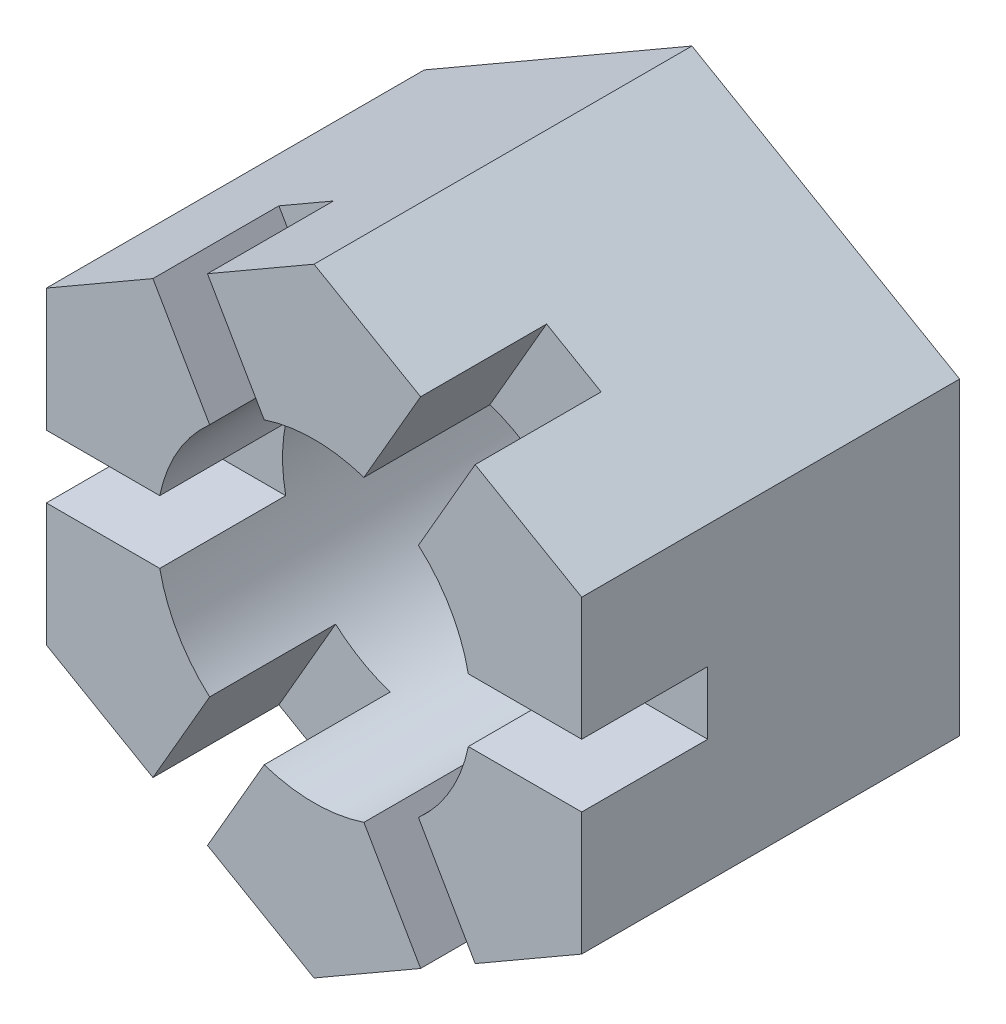
ISO-10303-21;
HEADER;
FILE_DESCRIPTION(('STEP AP214'),'2;1');
FILE_NAME('part.step','',(''),(''),'','','');
FILE_SCHEMA(('AUTOMOTIVE_DESIGN { 1 0 10303 214 1 1 1 1 }'));
ENDSEC;
DATA;
#1=APPLICATION_CONTEXT('core data for automotive mechanical design processes');
#2=APPLICATION_PROTOCOL_DEFINITION('international standard','automotive_design',2000,#1);
#3=PRODUCT_CONTEXT('',#1,'mechanical');
#4=PRODUCT('Part','Part','',(#3));
#5=PRODUCT_RELATED_PRODUCT_CATEGORY('part','',(#4));
#6=PRODUCT_DEFINITION_FORMATION('','',#4);
#7=PRODUCT_DEFINITION_CONTEXT('part definition',#1,'design');
#8=PRODUCT_DEFINITION('design','',#6,#7);
#9=PRODUCT_DEFINITION_SHAPE('','',#8);
#10=(LENGTH_UNIT() NAMED_UNIT(*) SI_UNIT(.MILLI.,.METRE.));
#11=(NAMED_UNIT(*) PLANE_ANGLE_UNIT() SI_UNIT($,.RADIAN.));
#12=(NAMED_UNIT(*) SI_UNIT($,.STERADIAN.) SOLID_ANGLE_UNIT());
#13=UNCERTAINTY_MEASURE_WITH_UNIT(LENGTH_MEASURE(1.E-05),#10,'distance_accuracy_value','');
#14=(GEOMETRIC_REPRESENTATION_CONTEXT(3) GLOBAL_UNCERTAINTY_ASSIGNED_CONTEXT((#13)) GLOBAL_UNIT_ASSIGNED_CONTEXT((#10,
#11,#12)) REPRESENTATION_CONTEXT('',''));
#15=CARTESIAN_POINT('',(0.,0.,0.));
#16=DIRECTION('',(0.,0.,1.));
#17=DIRECTION('',(1.,0.,0.));
#18=AXIS2_PLACEMENT_3D('',#15,#16,#17);
#19=CARTESIAN_POINT('',(0.,0.,12.));
#20=DIRECTION('',(0.,0.,-1.));
#21=DIRECTION('',(-1.,0.,0.));
#22=AXIS2_PLACEMENT_3D('',#19,#20,#21);
#23=PLANE('',#22);
#24=DIRECTION('',(-0.86602540378444,0.499999999999998,0.));
#25=VECTOR('',#24,1.);
#26=CARTESIAN_POINT('',(0.,9.81495457622361,12.));
#27=LINE('',#26,#25);
#28=CARTESIAN_POINT('',(8.5,4.90747728811182,12.));
#29=VERTEX_POINT('',#28);
#30=CARTESIAN_POINT('',(5.11602540378452,6.86121593216765,12.));
#31=VERTEX_POINT('',#30);
#32=EDGE_CURVE('E251',#29,#31,#27,.T.);
#33=ORIENTED_EDGE('',*,*,#32,.T.);
#34=DIRECTION('',(0.500000000000011,0.866025403784432,0.));
#35=VECTOR('',#34,1.);
#36=CARTESIAN_POINT('',(-5.50965760891762,-11.5430069109534,12.));
#37=LINE('',#36,#35);
#38=CARTESIAN_POINT('',(3.31551514656767,3.74264068711924,12.));
#39=VERTEX_POINT('',#38);
#40=EDGE_CURVE('E237',#39,#31,#37,.T.);
#41=ORIENTED_EDGE('',*,*,#40,.F.);
#42=CARTESIAN_POINT('',(0.,0.,12.));
#43=DIRECTION('',(0.,0.,1.));
#44=DIRECTION('',(1.,0.,0.));
#45=AXIS2_PLACEMENT_3D('',#42,#43,#44);
#46=CIRCLE('',#45,5.);
#47=CARTESIAN_POINT('',(4.89897948556636,0.999999999999992,12.));
#48=VERTEX_POINT('',#47);
#49=EDGE_CURVE('E249',#48,#39,#46,.T.);
#50=ORIENTED_EDGE('',*,*,#49,.F.);
#51=DIRECTION('',(1.,0.,0.));
#52=VECTOR('',#51,1.);
#53=CARTESIAN_POINT('',(-8.50100000000001,1.00000000000001,12.));
#54=LINE('',#53,#52);
#55=CARTESIAN_POINT('',(8.49999999999999,0.999999999999986,12.));
#56=VERTEX_POINT('',#55);
#57=EDGE_CURVE('E280',#48,#56,#54,.T.);
#58=ORIENTED_EDGE('',*,*,#57,.T.);
#59=DIRECTION('',(0.,1.,0.));
#60=VECTOR('',#59,1.);
#61=CARTESIAN_POINT('',(8.49999999999998,-4.90747728811181,12.));
#62=LINE('',#61,#60);
#63=EDGE_CURVE('E298',#56,#29,#62,.T.);
#64=ORIENTED_EDGE('',*,*,#63,.T.);
#65=EDGE_LOOP('',(#33,#41,#50,#58,#64));
#66=FACE_BOUND('',#65,.T.);
#67=ADVANCED_FACE('F36',(#66),#23,.F.);
#68=CARTESIAN_POINT('',(1.5834643389988,4.74264068711926,12.));
#69=VERTEX_POINT('',#68);
#70=CARTESIAN_POINT('',(-1.58346433899869,4.7426406871193,12.));
#71=VERTEX_POINT('',#70);
#72=EDGE_CURVE('E260',#69,#71,#46,.T.);
#73=ORIENTED_EDGE('',*,*,#72,.F.);
#74=DIRECTION('',(0.500000000000011,0.866025403784432,0.));
#75=VECTOR('',#74,1.);
#76=CARTESIAN_POINT('',(-7.24170841648649,-10.5430069109534,12.));
#77=LINE('',#76,#75);
#78=CARTESIAN_POINT('',(3.38397459621566,7.86121593216767,12.));
#79=VERTEX_POINT('',#78);
#80=EDGE_CURVE('E51',#69,#79,#77,.T.);
#81=ORIENTED_EDGE('',*,*,#80,.T.);
#82=CARTESIAN_POINT('',(0.,9.81495457622361,12.));
#83=VERTEX_POINT('',#82);
#84=EDGE_CURVE('E302',#79,#83,#27,.T.);
#85=ORIENTED_EDGE('',*,*,#84,.T.);
#86=DIRECTION('',(-0.86602540378444,-0.499999999999998,0.));
#87=VECTOR('',#86,1.);
#88=CARTESIAN_POINT('',(0.,9.81495457622361,12.));
#89=LINE('',#88,#87);
#90=CARTESIAN_POINT('',(-3.38397459621547,7.86121593216776,12.));
#91=VERTEX_POINT('',#90);
#92=EDGE_CURVE('E282',#83,#91,#89,.T.);
#93=ORIENTED_EDGE('',*,*,#92,.T.);
#94=DIRECTION('',(-0.499999999999991,0.866025403784444,0.));
#95=VECTOR('',#94,1.);
#96=CARTESIAN_POINT('',(7.24170841648621,-10.5430069109535,12.));
#97=LINE('',#96,#95);
#98=EDGE_CURVE('E437',#71,#91,#97,.T.);
#99=ORIENTED_EDGE('',*,*,#98,.F.);
#100=EDGE_LOOP('',(#73,#81,#85,#93,#99));
#101=FACE_BOUND('',#100,.T.);
#102=ADVANCED_FACE('F557',(#101),#23,.F.);
#103=CARTESIAN_POINT('',(-4.89897948556636,-0.999999999999992,12.));
#104=VERTEX_POINT('',#103);
#105=CARTESIAN_POINT('',(-3.31551514656764,-3.74264068711926,12.));
#106=VERTEX_POINT('',#105);
#107=EDGE_CURVE('E275',#104,#106,#46,.T.);
#108=ORIENTED_EDGE('',*,*,#107,.F.);
#109=DIRECTION('',(-1.,0.,0.));
#110=VECTOR('',#109,1.);
#111=CARTESIAN_POINT('',(8.50100000000001,-1.00000000000001,12.));
#112=LINE('',#111,#110);
#113=CARTESIAN_POINT('',(-8.49999999999999,-0.999999999999986,12.));
#114=VERTEX_POINT('',#113);
#115=EDGE_CURVE('E462',#104,#114,#112,.T.);
#116=ORIENTED_EDGE('',*,*,#115,.T.);
#117=DIRECTION('',(0.,-1.,0.));
#118=VECTOR('',#117,1.);
#119=CARTESIAN_POINT('',(-8.49999999999998,-4.90747728811181,12.));
#120=LINE('',#119,#118);
#121=CARTESIAN_POINT('',(-8.49999999999998,-4.90747728811181,12.));
#122=VERTEX_POINT('',#121);
#123=EDGE_CURVE('E285',#114,#122,#120,.T.);
#124=ORIENTED_EDGE('',*,*,#123,.T.);
#125=DIRECTION('',(0.866025403784438,-0.500000000000002,0.));
#126=VECTOR('',#125,1.);
#127=CARTESIAN_POINT('',(-8.49999999999998,-4.90747728811181,12.));
#128=LINE('',#127,#126);
#129=CARTESIAN_POINT('',(-5.11602540378448,-6.86121593216769,12.));
#130=VERTEX_POINT('',#129);
#131=EDGE_CURVE('E291',#122,#130,#128,.T.);
#132=ORIENTED_EDGE('',*,*,#131,.T.);
#133=DIRECTION('',(-0.500000000000005,-0.866025403784435,0.));
#134=VECTOR('',#133,1.);
#135=CARTESIAN_POINT('',(5.50965760891752,11.5430069109534,12.));
#136=LINE('',#135,#134);
#137=EDGE_CURVE('E487',#106,#130,#136,.T.);
#138=ORIENTED_EDGE('',*,*,#137,.F.);
#139=EDGE_LOOP('',(#108,#116,#124,#132,#138));
#140=FACE_BOUND('',#139,.T.);
#141=ADVANCED_FACE('F526',(#140),#23,.F.);
#142=CARTESIAN_POINT('',(-3.31551514656758,3.74264068711932,12.));
#143=VERTEX_POINT('',#142);
#144=CARTESIAN_POINT('',(-4.89897948556635,1.00000000000001,12.));
#145=VERTEX_POINT('',#144);
#146=EDGE_CURVE('E266',#143,#145,#46,.T.);
#147=ORIENTED_EDGE('',*,*,#146,.F.);
#148=DIRECTION('',(-0.499999999999991,0.866025403784444,0.));
#149=VECTOR('',#148,1.);
#150=CARTESIAN_POINT('',(5.50965760891732,-11.5430069109535,12.));
#151=LINE('',#150,#149);
#152=CARTESIAN_POINT('',(-5.11602540378436,6.86121593216777,12.));
#153=VERTEX_POINT('',#152);
#154=EDGE_CURVE('E59',#143,#153,#151,.T.);
#155=ORIENTED_EDGE('',*,*,#154,.T.);
#156=CARTESIAN_POINT('',(-8.5,4.90747728811182,12.));
#157=VERTEX_POINT('',#156);
#158=EDGE_CURVE('E286',#153,#157,#89,.T.);
#159=ORIENTED_EDGE('',*,*,#158,.T.);
#160=CARTESIAN_POINT('',(-8.49999999999999,1.00000000000001,12.));
#161=VERTEX_POINT('',#160);
#162=EDGE_CURVE('E287',#157,#161,#120,.T.);
#163=ORIENTED_EDGE('',*,*,#162,.T.);
#164=DIRECTION('',(-1.,0.,0.));
#165=VECTOR('',#164,1.);
#166=CARTESIAN_POINT('',(8.50100000000002,0.999999999999987,12.));
#167=LINE('',#166,#165);
#168=EDGE_CURVE('E461',#145,#161,#167,.T.);
#169=ORIENTED_EDGE('',*,*,#168,.F.);
#170=EDGE_LOOP('',(#147,#155,#159,#163,#169));
#171=FACE_BOUND('',#170,.T.);
#172=ADVANCED_FACE('F545',(#171),#23,.F.);
#173=CARTESIAN_POINT('',(-1.58346433899877,-4.74264068711928,12.));
#174=VERTEX_POINT('',#173);
#175=CARTESIAN_POINT('',(1.58346433899872,-4.74264068711929,12.));
#176=VERTEX_POINT('',#175);
#177=EDGE_CURVE('E269',#174,#176,#46,.T.);
#178=ORIENTED_EDGE('',*,*,#177,.F.);
#179=DIRECTION('',(-0.500000000000005,-0.866025403784435,0.));
#180=VECTOR('',#179,1.);
#181=CARTESIAN_POINT('',(7.24170841648639,10.5430069109534,12.));
#182=LINE('',#181,#180);
#183=CARTESIAN_POINT('',(-3.38397459621561,-7.8612159321677,12.));
#184=VERTEX_POINT('',#183);
#185=EDGE_CURVE('E488',#174,#184,#182,.T.);
#186=ORIENTED_EDGE('',*,*,#185,.T.);
#187=CARTESIAN_POINT('',(0.,-9.81495457622364,12.));
#188=VERTEX_POINT('',#187);
#189=EDGE_CURVE('E290',#184,#188,#128,.T.);
#190=ORIENTED_EDGE('',*,*,#189,.T.);
#191=DIRECTION('',(0.866025403784438,0.500000000000002,0.));
#192=VECTOR('',#191,1.);
#193=CARTESIAN_POINT('',(8.49999999999998,-4.90747728811181,12.));
#194=LINE('',#193,#192);
#195=CARTESIAN_POINT('',(3.38397459621552,-7.86121593216773,12.));
#196=VERTEX_POINT('',#195);
#197=EDGE_CURVE('E295',#188,#196,#194,.T.);
#198=ORIENTED_EDGE('',*,*,#197,.T.);
#199=DIRECTION('',(0.499999999999997,-0.866025403784441,0.));
#200=VECTOR('',#199,1.);
#201=CARTESIAN_POINT('',(-7.24170841648628,10.5430069109535,12.));
#202=LINE('',#201,#200);
#203=EDGE_CURVE('E367',#176,#196,#202,.T.);
#204=ORIENTED_EDGE('',*,*,#203,.F.);
#205=EDGE_LOOP('',(#178,#186,#190,#198,#204));
#206=FACE_BOUND('',#205,.T.);
#207=ADVANCED_FACE('F511',(#206),#23,.F.);
#208=CARTESIAN_POINT('',(3.3155151465676,-3.7426406871193,12.));
#209=VERTEX_POINT('',#208);
#210=CARTESIAN_POINT('',(4.89897948556635,-1.00000000000001,12.));
#211=VERTEX_POINT('',#210);
#212=EDGE_CURVE('E262',#209,#211,#46,.T.);
#213=ORIENTED_EDGE('',*,*,#212,.F.);
#214=DIRECTION('',(0.499999999999997,-0.866025403784441,0.));
#215=VECTOR('',#214,1.);
#216=CARTESIAN_POINT('',(-5.5096576089174,11.5430069109535,12.));
#217=LINE('',#216,#215);
#218=CARTESIAN_POINT('',(5.1160254037844,-6.86121593216774,12.));
#219=VERTEX_POINT('',#218);
#220=EDGE_CURVE('E360',#209,#219,#217,.T.);
#221=ORIENTED_EDGE('',*,*,#220,.T.);
#222=CARTESIAN_POINT('',(8.49999999999998,-4.90747728811181,12.));
#223=VERTEX_POINT('',#222);
#224=EDGE_CURVE('E294',#219,#223,#194,.T.);
#225=ORIENTED_EDGE('',*,*,#224,.T.);
#226=CARTESIAN_POINT('',(8.49999999999999,-1.00000000000001,12.));
#227=VERTEX_POINT('',#226);
#228=EDGE_CURVE('E299',#223,#227,#62,.T.);
#229=ORIENTED_EDGE('',*,*,#228,.T.);
#230=DIRECTION('',(1.,0.,0.));
#231=VECTOR('',#230,1.);
#232=CARTESIAN_POINT('',(-8.50100000000002,-0.999999999999987,12.));
#233=LINE('',#232,#231);
#234=EDGE_CURVE('E358',#211,#227,#233,.T.);
#235=ORIENTED_EDGE('',*,*,#234,.F.);
#236=EDGE_LOOP('',(#213,#221,#225,#229,#235));
#237=FACE_BOUND('',#236,.T.);
#238=ADVANCED_FACE('F357',(#237),#23,.F.);
#239=CARTESIAN_POINT('',(0.,0.,0.));
#240=DIRECTION('',(0.,0.,-1.));
#241=DIRECTION('',(-1.,0.,0.));
#242=AXIS2_PLACEMENT_3D('',#239,#240,#241);
#243=PLANE('',#242);
#244=DIRECTION('',(-0.86602540378444,-0.499999999999998,0.));
#245=VECTOR('',#244,1.);
#246=CARTESIAN_POINT('',(0.,9.81495457622361,0.));
#247=LINE('',#246,#245);
#248=CARTESIAN_POINT('',(0.,9.81495457622361,0.));
#249=VERTEX_POINT('',#248);
#250=CARTESIAN_POINT('',(-8.5,4.90747728811182,0.));
#251=VERTEX_POINT('',#250);
#252=EDGE_CURVE('E259',#249,#251,#247,.T.);
#253=ORIENTED_EDGE('',*,*,#252,.F.);
#254=DIRECTION('',(-0.86602540378444,0.499999999999998,0.));
#255=VECTOR('',#254,1.);
#256=CARTESIAN_POINT('',(0.,9.81495457622361,0.));
#257=LINE('',#256,#255);
#258=CARTESIAN_POINT('',(8.5,4.90747728811182,0.));
#259=VERTEX_POINT('',#258);
#260=EDGE_CURVE('E312',#259,#249,#257,.T.);
#261=ORIENTED_EDGE('',*,*,#260,.F.);
#262=DIRECTION('',(0.,1.,0.));
#263=VECTOR('',#262,1.);
#264=CARTESIAN_POINT('',(8.49999999999998,-4.90747728811181,0.));
#265=LINE('',#264,#263);
#266=CARTESIAN_POINT('',(8.49999999999998,-4.90747728811181,0.));
#267=VERTEX_POINT('',#266);
#268=EDGE_CURVE('E310',#267,#259,#265,.T.);
#269=ORIENTED_EDGE('',*,*,#268,.F.);
#270=DIRECTION('',(0.866025403784438,0.500000000000002,0.));
#271=VECTOR('',#270,1.);
#272=CARTESIAN_POINT('',(8.49999999999998,-4.90747728811181,0.));
#273=LINE('',#272,#271);
#274=CARTESIAN_POINT('',(0.,-9.81495457622364,0.));
#275=VERTEX_POINT('',#274);
#276=EDGE_CURVE('E308',#275,#267,#273,.T.);
#277=ORIENTED_EDGE('',*,*,#276,.F.);
#278=DIRECTION('',(0.866025403784438,-0.500000000000002,0.));
#279=VECTOR('',#278,1.);
#280=CARTESIAN_POINT('',(-8.49999999999998,-4.90747728811181,0.));
#281=LINE('',#280,#279);
#282=CARTESIAN_POINT('',(-8.49999999999998,-4.90747728811181,0.));
#283=VERTEX_POINT('',#282);
#284=EDGE_CURVE('E306',#283,#275,#281,.T.);
#285=ORIENTED_EDGE('',*,*,#284,.F.);
#286=DIRECTION('',(0.,-1.,0.));
#287=VECTOR('',#286,1.);
#288=CARTESIAN_POINT('',(-8.49999999999998,-4.90747728811181,0.));
#289=LINE('',#288,#287);
#290=EDGE_CURVE('E264',#251,#283,#289,.T.);
#291=ORIENTED_EDGE('',*,*,#290,.F.);
#292=EDGE_LOOP('',(#253,#261,#269,#277,#285,#291));
#293=FACE_BOUND('',#292,.T.);
#294=CARTESIAN_POINT('',(0.,0.,0.));
#295=DIRECTION('',(0.,0.,1.));
#296=DIRECTION('',(1.,0.,0.));
#297=AXIS2_PLACEMENT_3D('',#294,#295,#296);
#298=CIRCLE('',#297,5.);
#299=CARTESIAN_POINT('',(5.,0.,0.));
#300=VERTEX_POINT('',#299);
#301=EDGE_CURVE('E270',#300,#300,#298,.T.);
#302=ORIENTED_EDGE('',*,*,#301,.T.);
#303=EDGE_LOOP('',(#302));
#304=FACE_BOUND('',#303,.T.);
#305=ADVANCED_FACE('F338',(#293,#304),#243,.T.);
#306=CARTESIAN_POINT('',(0.,9.81495457622361,12.));
#307=DIRECTION('',(0.499999999999998,-0.86602540378444,0.));
#308=DIRECTION('',(0.86602540378444,0.499999999999998,0.));
#309=AXIS2_PLACEMENT_3D('',#306,#307,#308);
#310=PLANE('',#309);
#311=DIRECTION('',(-0.866025403784444,-0.49999999999999,0.));
#312=VECTOR('',#311,1.);
#313=CARTESIAN_POINT('',(-5.11602540378436,6.86121593216777,8.));
#314=LINE('',#313,#312);
#315=CARTESIAN_POINT('',(-3.38397459621547,7.86121593216776,8.));
#316=VERTEX_POINT('',#315);
#317=CARTESIAN_POINT('',(-5.11602540378436,6.86121593216777,8.));
#318=VERTEX_POINT('',#317);
#319=EDGE_CURVE('E432',#316,#318,#314,.T.);
#320=ORIENTED_EDGE('',*,*,#319,.F.);
#321=DIRECTION('',(0.,0.,-1.));
#322=VECTOR('',#321,1.);
#323=CARTESIAN_POINT('',(-3.38397459621547,7.86121593216776,8.));
#324=LINE('',#323,#322);
#325=EDGE_CURVE('E429',#91,#316,#324,.T.);
#326=ORIENTED_EDGE('',*,*,#325,.F.);
#327=ORIENTED_EDGE('',*,*,#92,.F.);
#328=DIRECTION('',(0.,0.,-1.));
#329=VECTOR('',#328,1.);
#330=CARTESIAN_POINT('',(0.,9.81495457622361,12.));
#331=LINE('',#330,#329);
#332=EDGE_CURVE('E303',#83,#249,#331,.T.);
#333=ORIENTED_EDGE('',*,*,#332,.T.);
#334=ORIENTED_EDGE('',*,*,#252,.T.);
#335=DIRECTION('',(0.,0.,-1.));
#336=VECTOR('',#335,1.);
#337=CARTESIAN_POINT('',(-8.5,4.90747728811182,12.));
#338=LINE('',#337,#336);
#339=EDGE_CURVE('E11',#157,#251,#338,.T.);
#340=ORIENTED_EDGE('',*,*,#339,.F.);
#341=ORIENTED_EDGE('',*,*,#158,.F.);
#342=DIRECTION('',(0.,0.,1.));
#343=VECTOR('',#342,1.);
#344=CARTESIAN_POINT('',(-5.11602540378436,6.86121593216777,8.));
#345=LINE('',#344,#343);
#346=EDGE_CURVE('E435',#318,#153,#345,.T.);
#347=ORIENTED_EDGE('',*,*,#346,.F.);
#348=EDGE_LOOP('',(#320,#326,#327,#333,#334,#340,#341,#347));
#349=FACE_BOUND('',#348,.T.);
#350=ADVANCED_FACE('F38',(#349),#310,.F.);
#351=CARTESIAN_POINT('',(-8.49999999999998,-4.90747728811181,12.));
#352=DIRECTION('',(1.,0.,0.));
#353=DIRECTION('',(0.,1.,0.));
#354=AXIS2_PLACEMENT_3D('',#351,#352,#353);
#355=PLANE('',#354);
#356=ORIENTED_EDGE('',*,*,#123,.F.);
#357=DIRECTION('',(0.,0.,1.));
#358=VECTOR('',#357,1.);
#359=CARTESIAN_POINT('',(-8.49999999999999,-0.999999999999986,8.));
#360=LINE('',#359,#358);
#361=CARTESIAN_POINT('',(-8.49999999999999,-0.999999999999986,8.));
#362=VERTEX_POINT('',#361);
#363=EDGE_CURVE('E459',#362,#114,#360,.T.);
#364=ORIENTED_EDGE('',*,*,#363,.F.);
#365=DIRECTION('',(0.,-1.,0.));
#366=VECTOR('',#365,1.);
#367=CARTESIAN_POINT('',(-8.49999999999999,-0.999999999999986,8.));
#368=LINE('',#367,#366);
#369=CARTESIAN_POINT('',(-8.49999999999999,1.00000000000001,8.));
#370=VERTEX_POINT('',#369);
#371=EDGE_CURVE('E456',#370,#362,#368,.T.);
#372=ORIENTED_EDGE('',*,*,#371,.F.);
#373=DIRECTION('',(0.,0.,-1.));
#374=VECTOR('',#373,1.);
#375=CARTESIAN_POINT('',(-8.49999999999999,1.00000000000001,8.));
#376=LINE('',#375,#374);
#377=EDGE_CURVE('E453',#161,#370,#376,.T.);
#378=ORIENTED_EDGE('',*,*,#377,.F.);
#379=ORIENTED_EDGE('',*,*,#162,.F.);
#380=ORIENTED_EDGE('',*,*,#339,.T.);
#381=ORIENTED_EDGE('',*,*,#290,.T.);
#382=DIRECTION('',(0.,0.,-1.));
#383=VECTOR('',#382,1.);
#384=CARTESIAN_POINT('',(-8.49999999999998,-4.90747728811181,12.));
#385=LINE('',#384,#383);
#386=EDGE_CURVE('E44',#122,#283,#385,.T.);
#387=ORIENTED_EDGE('',*,*,#386,.F.);
#388=EDGE_LOOP('',(#356,#364,#372,#378,#379,#380,#381,#387));
#389=FACE_BOUND('',#388,.T.);
#390=ADVANCED_FACE('F528',(#389),#355,.F.);
#391=CARTESIAN_POINT('',(-8.49999999999998,-4.90747728811181,12.));
#392=DIRECTION('',(0.500000000000002,0.866025403784438,0.));
#393=DIRECTION('',(-0.866025403784438,0.500000000000002,0.));
#394=AXIS2_PLACEMENT_3D('',#391,#392,#393);
#395=PLANE('',#394);
#396=DIRECTION('',(0.866025403784436,-0.500000000000006,0.));
#397=VECTOR('',#396,1.);
#398=CARTESIAN_POINT('',(-3.38397459621561,-7.8612159321677,8.));
#399=LINE('',#398,#397);
#400=CARTESIAN_POINT('',(-5.11602540378448,-6.86121593216769,8.));
#401=VERTEX_POINT('',#400);
#402=CARTESIAN_POINT('',(-3.38397459621561,-7.8612159321677,8.));
#403=VERTEX_POINT('',#402);
#404=EDGE_CURVE('E482',#401,#403,#399,.T.);
#405=ORIENTED_EDGE('',*,*,#404,.F.);
#406=DIRECTION('',(0.,0.,-1.));
#407=VECTOR('',#406,1.);
#408=CARTESIAN_POINT('',(-5.11602540378448,-6.86121593216769,8.));
#409=LINE('',#408,#407);
#410=EDGE_CURVE('E479',#130,#401,#409,.T.);
#411=ORIENTED_EDGE('',*,*,#410,.F.);
#412=ORIENTED_EDGE('',*,*,#131,.F.);
#413=ORIENTED_EDGE('',*,*,#386,.T.);
#414=ORIENTED_EDGE('',*,*,#284,.T.);
#415=DIRECTION('',(0.,0.,-1.));
#416=VECTOR('',#415,1.);
#417=CARTESIAN_POINT('',(0.,-9.81495457622364,12.));
#418=LINE('',#417,#416);
#419=EDGE_CURVE('E322',#188,#275,#418,.T.);
#420=ORIENTED_EDGE('',*,*,#419,.F.);
#421=ORIENTED_EDGE('',*,*,#189,.F.);
#422=DIRECTION('',(0.,0.,1.));
#423=VECTOR('',#422,1.);
#424=CARTESIAN_POINT('',(-3.38397459621561,-7.8612159321677,8.));
#425=LINE('',#424,#423);
#426=EDGE_CURVE('E485',#403,#184,#425,.T.);
#427=ORIENTED_EDGE('',*,*,#426,.F.);
#428=EDGE_LOOP('',(#405,#411,#412,#413,#414,#420,#421,#427));
#429=FACE_BOUND('',#428,.T.);
#430=ADVANCED_FACE('F330',(#429),#395,.F.);
#431=CARTESIAN_POINT('',(8.49999999999998,-4.90747728811181,12.));
#432=DIRECTION('',(-0.500000000000002,0.866025403784438,0.));
#433=DIRECTION('',(-0.866025403784438,-0.500000000000002,0.));
#434=AXIS2_PLACEMENT_3D('',#431,#432,#433);
#435=PLANE('',#434);
#436=DIRECTION('',(0.866025403784441,0.499999999999997,0.));
#437=VECTOR('',#436,1.);
#438=CARTESIAN_POINT('',(5.11602540378441,-6.86121593216774,8.));
#439=LINE('',#438,#437);
#440=CARTESIAN_POINT('',(3.38397459621552,-7.86121593216773,8.));
#441=VERTEX_POINT('',#440);
#442=CARTESIAN_POINT('',(5.11602540378441,-6.86121593216774,8.));
#443=VERTEX_POINT('',#442);
#444=EDGE_CURVE('E365',#441,#443,#439,.T.);
#445=ORIENTED_EDGE('',*,*,#444,.F.);
#446=DIRECTION('',(0.,0.,-1.));
#447=VECTOR('',#446,1.);
#448=CARTESIAN_POINT('',(3.38397459621552,-7.86121593216773,8.));
#449=LINE('',#448,#447);
#450=EDGE_CURVE('E371',#196,#441,#449,.T.);
#451=ORIENTED_EDGE('',*,*,#450,.F.);
#452=ORIENTED_EDGE('',*,*,#197,.F.);
#453=ORIENTED_EDGE('',*,*,#419,.T.);
#454=ORIENTED_EDGE('',*,*,#276,.T.);
#455=DIRECTION('',(0.,0.,-1.));
#456=VECTOR('',#455,1.);
#457=CARTESIAN_POINT('',(8.49999999999998,-4.90747728811181,12.));
#458=LINE('',#457,#456);
#459=EDGE_CURVE('E319',#223,#267,#458,.T.);
#460=ORIENTED_EDGE('',*,*,#459,.F.);
#461=ORIENTED_EDGE('',*,*,#224,.F.);
#462=DIRECTION('',(0.,0.,1.));
#463=VECTOR('',#462,1.);
#464=CARTESIAN_POINT('',(5.11602540378441,-6.86121593216774,8.));
#465=LINE('',#464,#463);
#466=EDGE_CURVE('E362',#443,#219,#465,.T.);
#467=ORIENTED_EDGE('',*,*,#466,.F.);
#468=EDGE_LOOP('',(#445,#451,#452,#453,#454,#460,#461,#467));
#469=FACE_BOUND('',#468,.T.);
#470=ADVANCED_FACE('F344',(#469),#435,.F.);
#471=CARTESIAN_POINT('',(8.49999999999998,-4.90747728811181,12.));
#472=DIRECTION('',(-1.,0.,0.));
#473=DIRECTION('',(0.,-1.,0.));
#474=AXIS2_PLACEMENT_3D('',#471,#472,#473);
#475=PLANE('',#474);
#476=DIRECTION('',(0.,1.,0.));
#477=VECTOR('',#476,1.);
#478=CARTESIAN_POINT('',(8.49999999999999,0.999999999999986,8.));
#479=LINE('',#478,#477);
#480=CARTESIAN_POINT('',(8.49999999999999,-1.00000000000001,8.));
#481=VERTEX_POINT('',#480);
#482=CARTESIAN_POINT('',(8.49999999999999,0.999999999999986,8.));
#483=VERTEX_POINT('',#482);
#484=EDGE_CURVE('E386',#481,#483,#479,.T.);
#485=ORIENTED_EDGE('',*,*,#484,.F.);
#486=DIRECTION('',(0.,0.,-1.));
#487=VECTOR('',#486,1.);
#488=CARTESIAN_POINT('',(8.49999999999999,-1.00000000000001,8.));
#489=LINE('',#488,#487);
#490=EDGE_CURVE('E354',#227,#481,#489,.T.);
#491=ORIENTED_EDGE('',*,*,#490,.F.);
#492=ORIENTED_EDGE('',*,*,#228,.F.);
#493=ORIENTED_EDGE('',*,*,#459,.T.);
#494=ORIENTED_EDGE('',*,*,#268,.T.);
#495=DIRECTION('',(0.,0.,-1.));
#496=VECTOR('',#495,1.);
#497=CARTESIAN_POINT('',(8.5,4.90747728811182,12.));
#498=LINE('',#497,#496);
#499=EDGE_CURVE('E316',#29,#259,#498,.T.);
#500=ORIENTED_EDGE('',*,*,#499,.F.);
#501=ORIENTED_EDGE('',*,*,#63,.F.);
#502=DIRECTION('',(0.,0.,1.));
#503=VECTOR('',#502,1.);
#504=CARTESIAN_POINT('',(8.49999999999999,0.999999999999986,8.));
#505=LINE('',#504,#503);
#506=EDGE_CURVE('E389',#483,#56,#505,.T.);
#507=ORIENTED_EDGE('',*,*,#506,.F.);
#508=EDGE_LOOP('',(#485,#491,#492,#493,#494,#500,#501,#507));
#509=FACE_BOUND('',#508,.T.);
#510=ADVANCED_FACE('F350',(#509),#475,.F.);
#511=CARTESIAN_POINT('',(0.,9.81495457622361,12.));
#512=DIRECTION('',(-0.499999999999998,-0.86602540378444,0.));
#513=DIRECTION('',(0.86602540378444,-0.499999999999998,0.));
#514=AXIS2_PLACEMENT_3D('',#511,#512,#513);
#515=PLANE('',#514);
#516=DIRECTION('',(-0.866025403784432,0.500000000000012,0.));
#517=VECTOR('',#516,1.);
#518=CARTESIAN_POINT('',(3.38397459621566,7.86121593216767,8.));
#519=LINE('',#518,#517);
#520=CARTESIAN_POINT('',(5.11602540378452,6.86121593216765,8.));
#521=VERTEX_POINT('',#520);
#522=CARTESIAN_POINT('',(3.38397459621566,7.86121593216767,8.));
#523=VERTEX_POINT('',#522);
#524=EDGE_CURVE('E412',#521,#523,#519,.T.);
#525=ORIENTED_EDGE('',*,*,#524,.F.);
#526=DIRECTION('',(0.,0.,-1.));
#527=VECTOR('',#526,1.);
#528=CARTESIAN_POINT('',(5.11602540378452,6.86121593216765,8.));
#529=LINE('',#528,#527);
#530=EDGE_CURVE('E409',#31,#521,#529,.T.);
#531=ORIENTED_EDGE('',*,*,#530,.F.);
#532=ORIENTED_EDGE('',*,*,#32,.F.);
#533=ORIENTED_EDGE('',*,*,#499,.T.);
#534=ORIENTED_EDGE('',*,*,#260,.T.);
#535=ORIENTED_EDGE('',*,*,#332,.F.);
#536=ORIENTED_EDGE('',*,*,#84,.F.);
#537=DIRECTION('',(0.,0.,1.));
#538=VECTOR('',#537,1.);
#539=CARTESIAN_POINT('',(3.38397459621566,7.86121593216767,8.));
#540=LINE('',#539,#538);
#541=EDGE_CURVE('E252',#523,#79,#540,.T.);
#542=ORIENTED_EDGE('',*,*,#541,.F.);
#543=EDGE_LOOP('',(#525,#531,#532,#533,#534,#535,#536,#542));
#544=FACE_BOUND('',#543,.T.);
#545=ADVANCED_FACE('F408',(#544),#515,.F.);
#546=CARTESIAN_POINT('',(0.,0.,12.));
#547=DIRECTION('',(0.,0.,-1.));
#548=DIRECTION('',(-1.,0.,0.));
#549=AXIS2_PLACEMENT_3D('',#546,#547,#548);
#550=CYLINDRICAL_SURFACE('',#549,5.);
#551=DIRECTION('',(0.,0.,-1.));
#552=VECTOR('',#551,1.);
#553=CARTESIAN_POINT('',(3.31551514656767,3.74264068711924,12.));
#554=LINE('',#553,#552);
#555=CARTESIAN_POINT('',(3.31551514656767,3.74264068711924,8.));
#556=VERTEX_POINT('',#555);
#557=EDGE_CURVE('E233',#39,#556,#554,.T.);
#558=ORIENTED_EDGE('',*,*,#557,.T.);
#559=CARTESIAN_POINT('',(0.,0.,8.));
#560=DIRECTION('',(0.,0.,-1.));
#561=DIRECTION('',(-1.,0.,0.));
#562=AXIS2_PLACEMENT_3D('',#559,#560,#561);
#563=CIRCLE('',#562,5.);
#564=CARTESIAN_POINT('',(1.5834643389988,4.74264068711926,8.));
#565=VERTEX_POINT('',#564);
#566=EDGE_CURVE('E416',#556,#565,#563,.F.);
#567=ORIENTED_EDGE('',*,*,#566,.T.);
#568=DIRECTION('',(0.,0.,-1.));
#569=VECTOR('',#568,1.);
#570=CARTESIAN_POINT('',(1.5834643389988,4.74264068711926,12.));
#571=LINE('',#570,#569);
#572=EDGE_CURVE('E413',#565,#69,#571,.F.);
#573=ORIENTED_EDGE('',*,*,#572,.T.);
#574=ORIENTED_EDGE('',*,*,#72,.T.);
#575=DIRECTION('',(0.,0.,-1.));
#576=VECTOR('',#575,1.);
#577=CARTESIAN_POINT('',(-1.58346433899869,4.7426406871193,12.));
#578=LINE('',#577,#576);
#579=CARTESIAN_POINT('',(-1.58346433899868,4.7426406871193,8.));
#580=VERTEX_POINT('',#579);
#581=EDGE_CURVE('E439',#71,#580,#578,.T.);
#582=ORIENTED_EDGE('',*,*,#581,.T.);
#583=CARTESIAN_POINT('',(0.,0.,8.));
#584=DIRECTION('',(0.,0.,-1.));
#585=DIRECTION('',(-1.,0.,0.));
#586=AXIS2_PLACEMENT_3D('',#583,#584,#585);
#587=CIRCLE('',#586,5.);
#588=CARTESIAN_POINT('',(-3.31551514656758,3.74264068711932,8.));
#589=VERTEX_POINT('',#588);
#590=EDGE_CURVE('E243',#580,#589,#587,.F.);
#591=ORIENTED_EDGE('',*,*,#590,.T.);
#592=DIRECTION('',(0.,0.,-1.));
#593=VECTOR('',#592,1.);
#594=CARTESIAN_POINT('',(-3.31551514656758,3.74264068711932,12.));
#595=LINE('',#594,#593);
#596=EDGE_CURVE('E427',#589,#143,#595,.F.);
#597=ORIENTED_EDGE('',*,*,#596,.T.);
#598=ORIENTED_EDGE('',*,*,#146,.T.);
#599=DIRECTION('',(0.,0.,-1.));
#600=VECTOR('',#599,1.);
#601=CARTESIAN_POINT('',(-4.89897948556635,1.00000000000001,12.));
#602=LINE('',#601,#600);
#603=CARTESIAN_POINT('',(-4.89897948556635,1.00000000000001,8.));
#604=VERTEX_POINT('',#603);
#605=EDGE_CURVE('E465',#145,#604,#602,.T.);
#606=ORIENTED_EDGE('',*,*,#605,.T.);
#607=CARTESIAN_POINT('',(0.,0.,8.));
#608=DIRECTION('',(0.,0.,-1.));
#609=DIRECTION('',(-1.,0.,0.));
#610=AXIS2_PLACEMENT_3D('',#607,#608,#609);
#611=CIRCLE('',#610,5.);
#612=CARTESIAN_POINT('',(-4.89897948556636,-0.999999999999992,8.));
#613=VERTEX_POINT('',#612);
#614=EDGE_CURVE('E447',#604,#613,#611,.F.);
#615=ORIENTED_EDGE('',*,*,#614,.T.);
#616=DIRECTION('',(0.,0.,-1.));
#617=VECTOR('',#616,1.);
#618=CARTESIAN_POINT('',(-4.89897948556636,-0.999999999999992,12.));
#619=LINE('',#618,#617);
#620=EDGE_CURVE('E450',#613,#104,#619,.F.);
#621=ORIENTED_EDGE('',*,*,#620,.T.);
#622=ORIENTED_EDGE('',*,*,#107,.T.);
#623=DIRECTION('',(0.,0.,-1.));
#624=VECTOR('',#623,1.);
#625=CARTESIAN_POINT('',(-3.31551514656764,-3.74264068711926,12.));
#626=LINE('',#625,#624);
#627=CARTESIAN_POINT('',(-3.31551514656764,-3.74264068711926,8.));
#628=VERTEX_POINT('',#627);
#629=EDGE_CURVE('E491',#106,#628,#626,.T.);
#630=ORIENTED_EDGE('',*,*,#629,.T.);
#631=CARTESIAN_POINT('',(0.,0.,8.));
#632=DIRECTION('',(0.,0.,-1.));
#633=DIRECTION('',(-1.,0.,0.));
#634=AXIS2_PLACEMENT_3D('',#631,#632,#633);
#635=CIRCLE('',#634,5.);
#636=CARTESIAN_POINT('',(-1.58346433899877,-4.74264068711928,8.));
#637=VERTEX_POINT('',#636);
#638=EDGE_CURVE('E473',#628,#637,#635,.F.);
#639=ORIENTED_EDGE('',*,*,#638,.T.);
#640=DIRECTION('',(0.,0.,-1.));
#641=VECTOR('',#640,1.);
#642=CARTESIAN_POINT('',(-1.58346433899877,-4.74264068711928,12.));
#643=LINE('',#642,#641);
#644=EDGE_CURVE('E476',#637,#174,#643,.F.);
#645=ORIENTED_EDGE('',*,*,#644,.T.);
#646=ORIENTED_EDGE('',*,*,#177,.T.);
#647=DIRECTION('',(0.,0.,-1.));
#648=VECTOR('',#647,1.);
#649=CARTESIAN_POINT('',(1.58346433899872,-4.74264068711929,12.));
#650=LINE('',#649,#648);
#651=CARTESIAN_POINT('',(1.58346433899872,-4.74264068711929,8.));
#652=VERTEX_POINT('',#651);
#653=EDGE_CURVE('E376',#176,#652,#650,.T.);
#654=ORIENTED_EDGE('',*,*,#653,.T.);
#655=CARTESIAN_POINT('',(0.,0.,8.));
#656=DIRECTION('',(0.,0.,-1.));
#657=DIRECTION('',(-1.,0.,0.));
#658=AXIS2_PLACEMENT_3D('',#655,#656,#657);
#659=CIRCLE('',#658,5.);
#660=CARTESIAN_POINT('',(3.3155151465676,-3.7426406871193,8.));
#661=VERTEX_POINT('',#660);
#662=EDGE_CURVE('E499',#652,#661,#659,.F.);
#663=ORIENTED_EDGE('',*,*,#662,.T.);
#664=DIRECTION('',(0.,0.,-1.));
#665=VECTOR('',#664,1.);
#666=CARTESIAN_POINT('',(3.3155151465676,-3.7426406871193,12.));
#667=LINE('',#666,#665);
#668=EDGE_CURVE('E502',#661,#209,#667,.F.);
#669=ORIENTED_EDGE('',*,*,#668,.T.);
#670=ORIENTED_EDGE('',*,*,#212,.T.);
#671=DIRECTION('',(0.,0.,-1.));
#672=VECTOR('',#671,1.);
#673=CARTESIAN_POINT('',(4.89897948556635,-1.00000000000001,12.));
#674=LINE('',#673,#672);
#675=CARTESIAN_POINT('',(4.89897948556636,-1.00000000000001,8.));
#676=VERTEX_POINT('',#675);
#677=EDGE_CURVE('E277',#211,#676,#674,.T.);
#678=ORIENTED_EDGE('',*,*,#677,.T.);
#679=CARTESIAN_POINT('',(0.,0.,8.));
#680=DIRECTION('',(0.,0.,-1.));
#681=DIRECTION('',(-1.,0.,0.));
#682=AXIS2_PLACEMENT_3D('',#679,#680,#681);
#683=CIRCLE('',#682,5.);
#684=CARTESIAN_POINT('',(4.89897948556636,0.999999999999992,8.));
#685=VERTEX_POINT('',#684);
#686=EDGE_CURVE('E382',#676,#685,#683,.F.);
#687=ORIENTED_EDGE('',*,*,#686,.T.);
#688=DIRECTION('',(0.,0.,-1.));
#689=VECTOR('',#688,1.);
#690=CARTESIAN_POINT('',(4.89897948556636,0.999999999999992,12.));
#691=LINE('',#690,#689);
#692=EDGE_CURVE('E258',#685,#48,#691,.F.);
#693=ORIENTED_EDGE('',*,*,#692,.T.);
#694=ORIENTED_EDGE('',*,*,#49,.T.);
#695=EDGE_LOOP('',(#558,#567,#573,#574,#582,#591,#597,#598,#606,#615,#621,#622,#630,#639,#645,
#646,#654,#663,#669,#670,#678,#687,#693,#694));
#696=FACE_BOUND('',#695,.T.);
#697=ORIENTED_EDGE('',*,*,#301,.F.);
#698=EDGE_LOOP('',(#697));
#699=FACE_BOUND('',#698,.T.);
#700=ADVANCED_FACE('F255',(#696,#699),#550,.F.);
#701=CARTESIAN_POINT('',(-8.50100000000002,-0.999999999999987,8.));
#702=DIRECTION('',(0.,-1.,0.));
#703=DIRECTION('',(1.,0.,0.));
#704=AXIS2_PLACEMENT_3D('',#701,#702,#703);
#705=PLANE('',#704);
#706=ORIENTED_EDGE('',*,*,#234,.T.);
#707=ORIENTED_EDGE('',*,*,#490,.T.);
#708=DIRECTION('',(1.,0.,0.));
#709=VECTOR('',#708,1.);
#710=CARTESIAN_POINT('',(-8.50100000000002,-0.999999999999987,8.));
#711=LINE('',#710,#709);
#712=EDGE_CURVE('E394',#676,#481,#711,.T.);
#713=ORIENTED_EDGE('',*,*,#712,.F.);
#714=ORIENTED_EDGE('',*,*,#677,.F.);
#715=EDGE_LOOP('',(#706,#707,#713,#714));
#716=FACE_BOUND('',#715,.T.);
#717=ADVANCED_FACE('F397',(#716),#705,.F.);
#718=CARTESIAN_POINT('',(-8.50100000000001,1.00000000000001,8.));
#719=DIRECTION('',(0.,0.,-1.));
#720=DIRECTION('',(-1.,0.,0.));
#721=AXIS2_PLACEMENT_3D('',#718,#719,#720);
#722=PLANE('',#721);
#723=ORIENTED_EDGE('',*,*,#712,.T.);
#724=ORIENTED_EDGE('',*,*,#484,.T.);
#725=DIRECTION('',(1.,0.,0.));
#726=VECTOR('',#725,1.);
#727=CARTESIAN_POINT('',(-8.50100000000001,1.00000000000001,8.));
#728=LINE('',#727,#726);
#729=EDGE_CURVE('E392',#685,#483,#728,.T.);
#730=ORIENTED_EDGE('',*,*,#729,.F.);
#731=ORIENTED_EDGE('',*,*,#686,.F.);
#732=EDGE_LOOP('',(#723,#724,#730,#731));
#733=FACE_BOUND('',#732,.T.);
#734=ADVANCED_FACE('F401',(#733),#722,.F.);
#735=CARTESIAN_POINT('',(-8.50100000000001,1.00000000000001,8.));
#736=DIRECTION('',(0.,1.,0.));
#737=DIRECTION('',(-1.,0.,0.));
#738=AXIS2_PLACEMENT_3D('',#735,#736,#737);
#739=PLANE('',#738);
#740=ORIENTED_EDGE('',*,*,#729,.T.);
#741=ORIENTED_EDGE('',*,*,#506,.T.);
#742=ORIENTED_EDGE('',*,*,#57,.F.);
#743=ORIENTED_EDGE('',*,*,#692,.F.);
#744=EDGE_LOOP('',(#740,#741,#742,#743));
#745=FACE_BOUND('',#744,.T.);
#746=ADVANCED_FACE('F404',(#745),#739,.F.);
#747=CARTESIAN_POINT('',(-7.24170841648628,10.5430069109535,8.));
#748=DIRECTION('',(-0.866025403784441,-0.499999999999997,0.));
#749=DIRECTION('',(0.499999999999997,-0.866025403784441,0.));
#750=AXIS2_PLACEMENT_3D('',#747,#748,#749);
#751=PLANE('',#750);
#752=ORIENTED_EDGE('',*,*,#203,.T.);
#753=ORIENTED_EDGE('',*,*,#450,.T.);
#754=DIRECTION('',(0.499999999999997,-0.866025403784441,0.));
#755=VECTOR('',#754,1.);
#756=CARTESIAN_POINT('',(-7.24170841648628,10.5430069109535,8.));
#757=LINE('',#756,#755);
#758=EDGE_CURVE('E369',#652,#441,#757,.T.);
#759=ORIENTED_EDGE('',*,*,#758,.F.);
#760=ORIENTED_EDGE('',*,*,#653,.F.);
#761=EDGE_LOOP('',(#752,#753,#759,#760));
#762=FACE_BOUND('',#761,.T.);
#763=ADVANCED_FACE('F506',(#762),#751,.F.);
#764=CARTESIAN_POINT('',(-5.5096576089174,11.5430069109535,8.));
#765=DIRECTION('',(0.,0.,-1.));
#766=DIRECTION('',(-1.,0.,0.));
#767=AXIS2_PLACEMENT_3D('',#764,#765,#766);
#768=PLANE('',#767);
#769=ORIENTED_EDGE('',*,*,#758,.T.);
#770=ORIENTED_EDGE('',*,*,#444,.T.);
#771=DIRECTION('',(0.499999999999997,-0.866025403784441,0.));
#772=VECTOR('',#771,1.);
#773=CARTESIAN_POINT('',(-5.5096576089174,11.5430069109535,8.));
#774=LINE('',#773,#772);
#775=EDGE_CURVE('E377',#661,#443,#774,.T.);
#776=ORIENTED_EDGE('',*,*,#775,.F.);
#777=ORIENTED_EDGE('',*,*,#662,.F.);
#778=EDGE_LOOP('',(#769,#770,#776,#777));
#779=FACE_BOUND('',#778,.T.);
#780=ADVANCED_FACE('F567',(#779),#768,.F.);
#781=CARTESIAN_POINT('',(-5.5096576089174,11.5430069109535,8.));
#782=DIRECTION('',(0.866025403784441,0.499999999999997,0.));
#783=DIRECTION('',(-0.499999999999997,0.866025403784441,0.));
#784=AXIS2_PLACEMENT_3D('',#781,#782,#783);
#785=PLANE('',#784);
#786=ORIENTED_EDGE('',*,*,#775,.T.);
#787=ORIENTED_EDGE('',*,*,#466,.T.);
#788=ORIENTED_EDGE('',*,*,#220,.F.);
#789=ORIENTED_EDGE('',*,*,#668,.F.);
#790=EDGE_LOOP('',(#786,#787,#788,#789));
#791=FACE_BOUND('',#790,.T.);
#792=ADVANCED_FACE('F568',(#791),#785,.F.);
#793=CARTESIAN_POINT('',(5.50965760891752,11.5430069109534,8.));
#794=DIRECTION('',(-0.866025403784435,0.500000000000005,0.));
#795=DIRECTION('',(-0.500000000000005,-0.866025403784436,0.));
#796=AXIS2_PLACEMENT_3D('',#793,#794,#795);
#797=PLANE('',#796);
#798=ORIENTED_EDGE('',*,*,#137,.T.);
#799=ORIENTED_EDGE('',*,*,#410,.T.);
#800=DIRECTION('',(-0.500000000000005,-0.866025403784435,0.));
#801=VECTOR('',#800,1.);
#802=CARTESIAN_POINT('',(5.50965760891752,11.5430069109534,8.));
#803=LINE('',#802,#801);
#804=EDGE_CURVE('E494',#628,#401,#803,.T.);
#805=ORIENTED_EDGE('',*,*,#804,.F.);
#806=ORIENTED_EDGE('',*,*,#629,.F.);
#807=EDGE_LOOP('',(#798,#799,#805,#806));
#808=FACE_BOUND('',#807,.T.);
#809=ADVANCED_FACE('F522',(#808),#797,.F.);
#810=CARTESIAN_POINT('',(7.24170841648639,10.5430069109534,8.));
#811=DIRECTION('',(0.,0.,-1.));
#812=DIRECTION('',(-1.,0.,0.));
#813=AXIS2_PLACEMENT_3D('',#810,#811,#812);
#814=PLANE('',#813);
#815=ORIENTED_EDGE('',*,*,#804,.T.);
#816=ORIENTED_EDGE('',*,*,#404,.T.);
#817=DIRECTION('',(-0.500000000000005,-0.866025403784435,0.));
#818=VECTOR('',#817,1.);
#819=CARTESIAN_POINT('',(7.24170841648639,10.5430069109534,8.));
#820=LINE('',#819,#818);
#821=EDGE_CURVE('E492',#637,#403,#820,.T.);
#822=ORIENTED_EDGE('',*,*,#821,.F.);
#823=ORIENTED_EDGE('',*,*,#638,.F.);
#824=EDGE_LOOP('',(#815,#816,#822,#823));
#825=FACE_BOUND('',#824,.T.);
#826=ADVANCED_FACE('F518',(#825),#814,.F.);
#827=CARTESIAN_POINT('',(7.24170841648639,10.5430069109534,8.));
#828=DIRECTION('',(0.866025403784435,-0.500000000000005,0.));
#829=DIRECTION('',(0.500000000000005,0.866025403784436,0.));
#830=AXIS2_PLACEMENT_3D('',#827,#828,#829);
#831=PLANE('',#830);
#832=ORIENTED_EDGE('',*,*,#821,.T.);
#833=ORIENTED_EDGE('',*,*,#426,.T.);
#834=ORIENTED_EDGE('',*,*,#185,.F.);
#835=ORIENTED_EDGE('',*,*,#644,.F.);
#836=EDGE_LOOP('',(#832,#833,#834,#835));
#837=FACE_BOUND('',#836,.T.);
#838=ADVANCED_FACE('F515',(#837),#831,.F.);
#839=CARTESIAN_POINT('',(8.50100000000001,-1.00000000000001,8.));
#840=DIRECTION('',(0.,-1.,0.));
#841=DIRECTION('',(1.,0.,0.));
#842=AXIS2_PLACEMENT_3D('',#839,#840,#841);
#843=PLANE('',#842);
#844=DIRECTION('',(-1.,0.,0.));
#845=VECTOR('',#844,1.);
#846=CARTESIAN_POINT('',(8.50100000000001,-1.00000000000001,8.));
#847=LINE('',#846,#845);
#848=EDGE_CURVE('E466',#613,#362,#847,.T.);
#849=ORIENTED_EDGE('',*,*,#848,.T.);
#850=ORIENTED_EDGE('',*,*,#363,.T.);
#851=ORIENTED_EDGE('',*,*,#115,.F.);
#852=ORIENTED_EDGE('',*,*,#620,.F.);
#853=EDGE_LOOP('',(#849,#850,#851,#852));
#854=FACE_BOUND('',#853,.T.);
#855=ADVANCED_FACE('F532',(#854),#843,.F.);
#856=CARTESIAN_POINT('',(8.50100000000001,-1.00000000000001,8.));
#857=DIRECTION('',(0.,0.,-1.));
#858=DIRECTION('',(-1.,0.,0.));
#859=AXIS2_PLACEMENT_3D('',#856,#857,#858);
#860=PLANE('',#859);
#861=DIRECTION('',(-1.,0.,0.));
#862=VECTOR('',#861,1.);
#863=CARTESIAN_POINT('',(8.50100000000002,0.999999999999987,8.));
#864=LINE('',#863,#862);
#865=EDGE_CURVE('E468',#604,#370,#864,.T.);
#866=ORIENTED_EDGE('',*,*,#865,.T.);
#867=ORIENTED_EDGE('',*,*,#371,.T.);
#868=ORIENTED_EDGE('',*,*,#848,.F.);
#869=ORIENTED_EDGE('',*,*,#614,.F.);
#870=EDGE_LOOP('',(#866,#867,#868,#869));
#871=FACE_BOUND('',#870,.T.);
#872=ADVANCED_FACE('F536',(#871),#860,.F.);
#873=CARTESIAN_POINT('',(8.50100000000002,0.999999999999987,8.));
#874=DIRECTION('',(0.,1.,0.));
#875=DIRECTION('',(-1.,0.,0.));
#876=AXIS2_PLACEMENT_3D('',#873,#874,#875);
#877=PLANE('',#876);
#878=ORIENTED_EDGE('',*,*,#168,.T.);
#879=ORIENTED_EDGE('',*,*,#377,.T.);
#880=ORIENTED_EDGE('',*,*,#865,.F.);
#881=ORIENTED_EDGE('',*,*,#605,.F.);
#882=EDGE_LOOP('',(#878,#879,#880,#881));
#883=FACE_BOUND('',#882,.T.);
#884=ADVANCED_FACE('F539',(#883),#877,.F.);
#885=CARTESIAN_POINT('',(7.24170841648621,-10.5430069109535,8.));
#886=DIRECTION('',(0.866025403784444,0.499999999999991,0.));
#887=DIRECTION('',(-0.499999999999991,0.866025403784444,0.));
#888=AXIS2_PLACEMENT_3D('',#885,#886,#887);
#889=PLANE('',#888);
#890=ORIENTED_EDGE('',*,*,#98,.T.);
#891=ORIENTED_EDGE('',*,*,#325,.T.);
#892=DIRECTION('',(-0.499999999999991,0.866025403784444,0.));
#893=VECTOR('',#892,1.);
#894=CARTESIAN_POINT('',(7.24170841648621,-10.5430069109535,8.));
#895=LINE('',#894,#893);
#896=EDGE_CURVE('E442',#580,#316,#895,.T.);
#897=ORIENTED_EDGE('',*,*,#896,.F.);
#898=ORIENTED_EDGE('',*,*,#581,.F.);
#899=EDGE_LOOP('',(#890,#891,#897,#898));
#900=FACE_BOUND('',#899,.T.);
#901=ADVANCED_FACE('F561',(#900),#889,.F.);
#902=CARTESIAN_POINT('',(5.50965760891732,-11.5430069109535,8.));
#903=DIRECTION('',(0.,0.,-1.));
#904=DIRECTION('',(-1.,0.,0.));
#905=AXIS2_PLACEMENT_3D('',#902,#903,#904);
#906=PLANE('',#905);
#907=ORIENTED_EDGE('',*,*,#896,.T.);
#908=ORIENTED_EDGE('',*,*,#319,.T.);
#909=DIRECTION('',(-0.499999999999991,0.866025403784444,0.));
#910=VECTOR('',#909,1.);
#911=CARTESIAN_POINT('',(5.50965760891732,-11.5430069109535,8.));
#912=LINE('',#911,#910);
#913=EDGE_CURVE('E440',#589,#318,#912,.T.);
#914=ORIENTED_EDGE('',*,*,#913,.F.);
#915=ORIENTED_EDGE('',*,*,#590,.F.);
#916=EDGE_LOOP('',(#907,#908,#914,#915));
#917=FACE_BOUND('',#916,.T.);
#918=ADVANCED_FACE('F563',(#917),#906,.F.);
#919=CARTESIAN_POINT('',(5.50965760891732,-11.5430069109535,8.));
#920=DIRECTION('',(-0.866025403784444,-0.499999999999991,0.));
#921=DIRECTION('',(0.499999999999991,-0.866025403784444,0.));
#922=AXIS2_PLACEMENT_3D('',#919,#920,#921);
#923=PLANE('',#922);
#924=ORIENTED_EDGE('',*,*,#913,.T.);
#925=ORIENTED_EDGE('',*,*,#346,.T.);
#926=ORIENTED_EDGE('',*,*,#154,.F.);
#927=ORIENTED_EDGE('',*,*,#596,.F.);
#928=EDGE_LOOP('',(#924,#925,#926,#927));
#929=FACE_BOUND('',#928,.T.);
#930=ADVANCED_FACE('F766',(#929),#923,.F.);
#931=CARTESIAN_POINT('',(-5.50965760891762,-11.5430069109534,8.));
#932=DIRECTION('',(0.866025403784432,-0.500000000000011,0.));
#933=DIRECTION('',(0.500000000000011,0.866025403784432,0.));
#934=AXIS2_PLACEMENT_3D('',#931,#932,#933);
#935=PLANE('',#934);
#936=ORIENTED_EDGE('',*,*,#40,.T.);
#937=ORIENTED_EDGE('',*,*,#530,.T.);
#938=DIRECTION('',(0.500000000000011,0.866025403784432,0.));
#939=VECTOR('',#938,1.);
#940=CARTESIAN_POINT('',(-5.50965760891762,-11.5430069109534,8.));
#941=LINE('',#940,#939);
#942=EDGE_CURVE('E239',#556,#521,#941,.T.);
#943=ORIENTED_EDGE('',*,*,#942,.F.);
#944=ORIENTED_EDGE('',*,*,#557,.F.);
#945=EDGE_LOOP('',(#936,#937,#943,#944));
#946=FACE_BOUND('',#945,.T.);
#947=ADVANCED_FACE('F235',(#946),#935,.F.);
#948=CARTESIAN_POINT('',(-7.24170841648649,-10.5430069109534,8.));
#949=DIRECTION('',(0.,0.,-1.));
#950=DIRECTION('',(-1.,0.,0.));
#951=AXIS2_PLACEMENT_3D('',#948,#949,#950);
#952=PLANE('',#951);
#953=ORIENTED_EDGE('',*,*,#942,.T.);
#954=ORIENTED_EDGE('',*,*,#524,.T.);
#955=DIRECTION('',(0.500000000000011,0.866025403784432,0.));
#956=VECTOR('',#955,1.);
#957=CARTESIAN_POINT('',(-7.24170841648649,-10.5430069109534,8.));
#958=LINE('',#957,#956);
#959=EDGE_CURVE('E422',#565,#523,#958,.T.);
#960=ORIENTED_EDGE('',*,*,#959,.F.);
#961=ORIENTED_EDGE('',*,*,#566,.F.);
#962=EDGE_LOOP('',(#953,#954,#960,#961));
#963=FACE_BOUND('',#962,.T.);
#964=ADVANCED_FACE('F783',(#963),#952,.F.);
#965=CARTESIAN_POINT('',(-7.24170841648649,-10.5430069109534,8.));
#966=DIRECTION('',(-0.866025403784432,0.500000000000011,0.));
#967=DIRECTION('',(-0.500000000000011,-0.866025403784432,0.));
#968=AXIS2_PLACEMENT_3D('',#965,#966,#967);
#969=PLANE('',#968);
#970=ORIENTED_EDGE('',*,*,#959,.T.);
#971=ORIENTED_EDGE('',*,*,#541,.T.);
#972=ORIENTED_EDGE('',*,*,#80,.F.);
#973=ORIENTED_EDGE('',*,*,#572,.F.);
#974=EDGE_LOOP('',(#970,#971,#972,#973));
#975=FACE_BOUND('',#974,.T.);
#976=ADVANCED_FACE('F792',(#975),#969,.F.);
#977=CLOSED_SHELL('',(#67,#102,#141,#172,#207,#238,#305,#350,#390,#430,#470,#510,#545,#700,#717,
#734,#746,#763,#780,#792,#809,#826,#838,#855,#872,#884,#901,#918,#930,#947,#964,#976));
#978=MANIFOLD_SOLID_BREP('B2',#977);
#979=ADVANCED_BREP_SHAPE_REPRESENTATION('',(#18,#978),#14);
#980=SHAPE_DEFINITION_REPRESENTATION(#9,#979);
ENDSEC;
END-ISO-10303-21;
